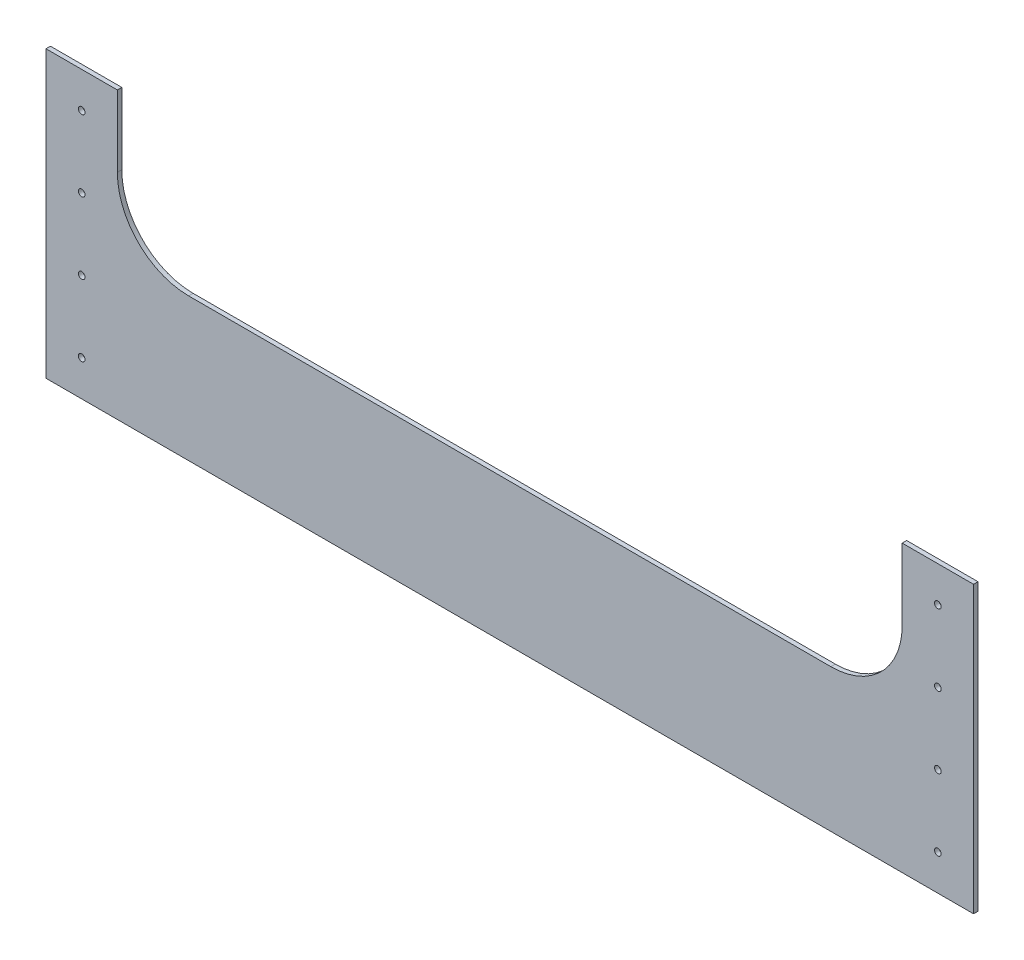
ISO-10303-21;
HEADER;
FILE_DESCRIPTION(('STEP AP214'),'2;1');
FILE_NAME('part.step','',(''),(''),'','','');
FILE_SCHEMA(('AUTOMOTIVE_DESIGN { 1 0 10303 214 1 1 1 1 }'));
ENDSEC;
DATA;
#1=APPLICATION_CONTEXT('core data for automotive mechanical design processes');
#2=APPLICATION_PROTOCOL_DEFINITION('international standard','automotive_design',2000,#1);
#3=PRODUCT_CONTEXT('',#1,'mechanical');
#4=PRODUCT('Part','Part','',(#3));
#5=PRODUCT_RELATED_PRODUCT_CATEGORY('part','',(#4));
#6=PRODUCT_DEFINITION_FORMATION('','',#4);
#7=PRODUCT_DEFINITION_CONTEXT('part definition',#1,'design');
#8=PRODUCT_DEFINITION('design','',#6,#7);
#9=PRODUCT_DEFINITION_SHAPE('','',#8);
#10=(LENGTH_UNIT() NAMED_UNIT(*) SI_UNIT(.MILLI.,.METRE.));
#11=(NAMED_UNIT(*) PLANE_ANGLE_UNIT() SI_UNIT($,.RADIAN.));
#12=(NAMED_UNIT(*) SI_UNIT($,.STERADIAN.) SOLID_ANGLE_UNIT());
#13=UNCERTAINTY_MEASURE_WITH_UNIT(LENGTH_MEASURE(1.E-05),#10,'distance_accuracy_value','');
#14=(GEOMETRIC_REPRESENTATION_CONTEXT(3) GLOBAL_UNCERTAINTY_ASSIGNED_CONTEXT((#13)) GLOBAL_UNIT_ASSIGNED_CONTEXT((#10,
#11,#12)) REPRESENTATION_CONTEXT('',''));
#15=CARTESIAN_POINT('',(0.,0.,0.));
#16=DIRECTION('',(0.,0.,1.));
#17=DIRECTION('',(1.,0.,0.));
#18=AXIS2_PLACEMENT_3D('',#15,#16,#17);
#19=CARTESIAN_POINT('',(-228.6,152.4,3.175));
#20=DIRECTION('',(0.,0.,1.));
#21=DIRECTION('',(1.,0.,0.));
#22=AXIS2_PLACEMENT_3D('',#19,#20,#21);
#23=PLANE('',#22);
#24=CARTESIAN_POINT('',(304.800000000003,76.2,3.175));
#25=DIRECTION('',(0.,0.,1.));
#26=DIRECTION('',(1.,0.,0.));
#27=AXIS2_PLACEMENT_3D('',#24,#25,#26);
#28=CIRCLE('',#27,2.38125);
#29=CARTESIAN_POINT('',(307.181250000003,76.2,3.175));
#30=VERTEX_POINT('',#29);
#31=EDGE_CURVE('E250',#30,#30,#28,.T.);
#32=ORIENTED_EDGE('',*,*,#31,.F.);
#33=EDGE_LOOP('',(#32));
#34=FACE_BOUND('',#33,.T.);
#35=CARTESIAN_POINT('',(304.8,177.8,3.175));
#36=DIRECTION('',(0.,0.,1.));
#37=DIRECTION('',(1.,0.,0.));
#38=AXIS2_PLACEMENT_3D('',#35,#36,#37);
#39=CIRCLE('',#38,2.38125);
#40=CARTESIAN_POINT('',(307.18125,177.8,3.175));
#41=VERTEX_POINT('',#40);
#42=EDGE_CURVE('E238',#41,#41,#39,.T.);
#43=ORIENTED_EDGE('',*,*,#42,.F.);
#44=EDGE_LOOP('',(#43));
#45=FACE_BOUND('',#44,.T.);
#46=CARTESIAN_POINT('',(-304.799999999999,76.2,3.175));
#47=DIRECTION('',(0.,0.,1.));
#48=DIRECTION('',(1.,0.,0.));
#49=AXIS2_PLACEMENT_3D('',#46,#47,#48);
#50=CIRCLE('',#49,2.38125);
#51=CARTESIAN_POINT('',(-302.418749999999,76.2,3.175));
#52=VERTEX_POINT('',#51);
#53=EDGE_CURVE('E226',#52,#52,#50,.T.);
#54=ORIENTED_EDGE('',*,*,#53,.F.);
#55=EDGE_LOOP('',(#54));
#56=FACE_BOUND('',#55,.T.);
#57=CARTESIAN_POINT('',(-304.8,177.8,3.175));
#58=DIRECTION('',(0.,0.,1.));
#59=DIRECTION('',(1.,0.,0.));
#60=AXIS2_PLACEMENT_3D('',#57,#58,#59);
#61=CIRCLE('',#60,2.38125);
#62=CARTESIAN_POINT('',(-302.41875,177.8,3.175));
#63=VERTEX_POINT('',#62);
#64=EDGE_CURVE('E154',#63,#63,#61,.T.);
#65=ORIENTED_EDGE('',*,*,#64,.F.);
#66=EDGE_LOOP('',(#65));
#67=FACE_BOUND('',#66,.T.);
#68=DIRECTION('',(-1.,0.,0.));
#69=VECTOR('',#68,1.);
#70=CARTESIAN_POINT('',(-330.2,203.2,3.175));
#71=LINE('',#70,#69);
#72=CARTESIAN_POINT('',(-279.4,203.2,3.175));
#73=VERTEX_POINT('',#72);
#74=CARTESIAN_POINT('',(-330.2,203.2,3.175));
#75=VERTEX_POINT('',#74);
#76=EDGE_CURVE('E169',#73,#75,#71,.T.);
#77=ORIENTED_EDGE('',*,*,#76,.T.);
#78=DIRECTION('',(0.,-1.,0.));
#79=VECTOR('',#78,1.);
#80=CARTESIAN_POINT('',(-330.2,0.,3.175));
#81=LINE('',#80,#79);
#82=CARTESIAN_POINT('',(-330.2,0.,3.175));
#83=VERTEX_POINT('',#82);
#84=EDGE_CURVE('E107',#75,#83,#81,.T.);
#85=ORIENTED_EDGE('',*,*,#84,.T.);
#86=DIRECTION('',(1.,0.,0.));
#87=VECTOR('',#86,1.);
#88=CARTESIAN_POINT('',(330.2,0.,3.175));
#89=LINE('',#88,#87);
#90=CARTESIAN_POINT('',(330.2,0.,3.175));
#91=VERTEX_POINT('',#90);
#92=EDGE_CURVE('E190',#83,#91,#89,.T.);
#93=ORIENTED_EDGE('',*,*,#92,.T.);
#94=DIRECTION('',(0.,1.,0.));
#95=VECTOR('',#94,1.);
#96=CARTESIAN_POINT('',(330.2,203.2,3.175));
#97=LINE('',#96,#95);
#98=CARTESIAN_POINT('',(330.2,203.2,3.175));
#99=VERTEX_POINT('',#98);
#100=EDGE_CURVE('E209',#91,#99,#97,.T.);
#101=ORIENTED_EDGE('',*,*,#100,.T.);
#102=DIRECTION('',(-1.,0.,0.));
#103=VECTOR('',#102,1.);
#104=CARTESIAN_POINT('',(279.4,203.2,3.175));
#105=LINE('',#104,#103);
#106=CARTESIAN_POINT('',(279.4,203.2,3.175));
#107=VERTEX_POINT('',#106);
#108=EDGE_CURVE('E206',#99,#107,#105,.T.);
#109=ORIENTED_EDGE('',*,*,#108,.T.);
#110=DIRECTION('',(0.,-1.,0.));
#111=VECTOR('',#110,1.);
#112=CARTESIAN_POINT('',(279.4,152.4,3.175));
#113=LINE('',#112,#111);
#114=CARTESIAN_POINT('',(279.4,152.4,3.175));
#115=VERTEX_POINT('',#114);
#116=EDGE_CURVE('E208',#107,#115,#113,.T.);
#117=ORIENTED_EDGE('',*,*,#116,.T.);
#118=CARTESIAN_POINT('',(228.6,152.4,3.175));
#119=DIRECTION('',(0.,0.,-1.));
#120=DIRECTION('',(1.,0.,0.));
#121=AXIS2_PLACEMENT_3D('',#118,#119,#120);
#122=CIRCLE('',#121,50.8);
#123=CARTESIAN_POINT('',(228.6,101.6,3.175));
#124=VERTEX_POINT('',#123);
#125=EDGE_CURVE('E132',#115,#124,#122,.T.);
#126=ORIENTED_EDGE('',*,*,#125,.T.);
#127=DIRECTION('',(-1.,0.,0.));
#128=VECTOR('',#127,1.);
#129=CARTESIAN_POINT('',(-228.6,101.6,3.175));
#130=LINE('',#129,#128);
#131=CARTESIAN_POINT('',(-228.6,101.6,3.175));
#132=VERTEX_POINT('',#131);
#133=EDGE_CURVE('E126',#124,#132,#130,.T.);
#134=ORIENTED_EDGE('',*,*,#133,.T.);
#135=CARTESIAN_POINT('',(-228.6,152.4,3.175));
#136=DIRECTION('',(0.,0.,-1.));
#137=DIRECTION('',(1.,0.,0.));
#138=AXIS2_PLACEMENT_3D('',#135,#136,#137);
#139=CIRCLE('',#138,50.8);
#140=CARTESIAN_POINT('',(-279.4,152.4,3.175));
#141=VERTEX_POINT('',#140);
#142=EDGE_CURVE('E130',#132,#141,#139,.T.);
#143=ORIENTED_EDGE('',*,*,#142,.T.);
#144=DIRECTION('',(0.,1.,0.));
#145=VECTOR('',#144,1.);
#146=CARTESIAN_POINT('',(-279.4,203.2,3.175));
#147=LINE('',#146,#145);
#148=EDGE_CURVE('E58',#141,#73,#147,.T.);
#149=ORIENTED_EDGE('',*,*,#148,.T.);
#150=EDGE_LOOP('',(#77,#85,#93,#101,#109,#117,#126,#134,#143,#149));
#151=FACE_BOUND('',#150,.T.);
#152=CARTESIAN_POINT('',(-304.799999999999,127.,3.175));
#153=DIRECTION('',(0.,0.,1.));
#154=DIRECTION('',(1.,0.,0.));
#155=AXIS2_PLACEMENT_3D('',#152,#153,#154);
#156=CIRCLE('',#155,2.38125000000001);
#157=CARTESIAN_POINT('',(-302.418749999999,127.,3.175));
#158=VERTEX_POINT('',#157);
#159=EDGE_CURVE('E220',#158,#158,#156,.T.);
#160=ORIENTED_EDGE('',*,*,#159,.F.);
#161=EDGE_LOOP('',(#160));
#162=FACE_BOUND('',#161,.T.);
#163=CARTESIAN_POINT('',(-304.799999999998,25.4,3.175));
#164=DIRECTION('',(0.,0.,1.));
#165=DIRECTION('',(1.,0.,0.));
#166=AXIS2_PLACEMENT_3D('',#163,#164,#165);
#167=CIRCLE('',#166,2.38125);
#168=CARTESIAN_POINT('',(-302.418749999998,25.4,3.175));
#169=VERTEX_POINT('',#168);
#170=EDGE_CURVE('E232',#169,#169,#167,.T.);
#171=ORIENTED_EDGE('',*,*,#170,.F.);
#172=EDGE_LOOP('',(#171));
#173=FACE_BOUND('',#172,.T.);
#174=CARTESIAN_POINT('',(304.800000000001,127.,3.175));
#175=DIRECTION('',(0.,0.,1.));
#176=DIRECTION('',(1.,0.,0.));
#177=AXIS2_PLACEMENT_3D('',#174,#175,#176);
#178=CIRCLE('',#177,2.38125);
#179=CARTESIAN_POINT('',(307.181250000001,127.,3.175));
#180=VERTEX_POINT('',#179);
#181=EDGE_CURVE('E244',#180,#180,#178,.T.);
#182=ORIENTED_EDGE('',*,*,#181,.F.);
#183=EDGE_LOOP('',(#182));
#184=FACE_BOUND('',#183,.T.);
#185=CARTESIAN_POINT('',(304.800000000004,25.3999999999999,3.175));
#186=DIRECTION('',(0.,0.,1.));
#187=DIRECTION('',(1.,0.,0.));
#188=AXIS2_PLACEMENT_3D('',#185,#186,#187);
#189=CIRCLE('',#188,2.38125000000001);
#190=CARTESIAN_POINT('',(307.181250000004,25.3999999999999,3.175));
#191=VERTEX_POINT('',#190);
#192=EDGE_CURVE('E256',#191,#191,#189,.T.);
#193=ORIENTED_EDGE('',*,*,#192,.F.);
#194=EDGE_LOOP('',(#193));
#195=FACE_BOUND('',#194,.T.);
#196=ADVANCED_FACE('F41',(#34,#45,#56,#67,#151,#162,#173,#184,#195),#23,.T.);
#197=CARTESIAN_POINT('',(-228.6,152.4,0.));
#198=DIRECTION('',(0.,0.,1.));
#199=DIRECTION('',(1.,0.,0.));
#200=AXIS2_PLACEMENT_3D('',#197,#198,#199);
#201=PLANE('',#200);
#202=DIRECTION('',(-1.,0.,0.));
#203=VECTOR('',#202,1.);
#204=CARTESIAN_POINT('',(-330.2,203.2,0.));
#205=LINE('',#204,#203);
#206=CARTESIAN_POINT('',(-279.4,203.2,0.));
#207=VERTEX_POINT('',#206);
#208=CARTESIAN_POINT('',(-330.2,203.2,0.));
#209=VERTEX_POINT('',#208);
#210=EDGE_CURVE('E150',#207,#209,#205,.T.);
#211=ORIENTED_EDGE('',*,*,#210,.F.);
#212=DIRECTION('',(0.,1.,0.));
#213=VECTOR('',#212,1.);
#214=CARTESIAN_POINT('',(-279.4,203.2,0.));
#215=LINE('',#214,#213);
#216=CARTESIAN_POINT('',(-279.4,152.4,0.));
#217=VERTEX_POINT('',#216);
#218=EDGE_CURVE('E99',#217,#207,#215,.T.);
#219=ORIENTED_EDGE('',*,*,#218,.F.);
#220=CARTESIAN_POINT('',(-228.6,152.4,0.));
#221=DIRECTION('',(0.,0.,-1.));
#222=DIRECTION('',(1.,0.,0.));
#223=AXIS2_PLACEMENT_3D('',#220,#221,#222);
#224=CIRCLE('',#223,50.8);
#225=CARTESIAN_POINT('',(-228.6,101.6,0.));
#226=VERTEX_POINT('',#225);
#227=EDGE_CURVE('E93',#226,#217,#224,.T.);
#228=ORIENTED_EDGE('',*,*,#227,.F.);
#229=DIRECTION('',(-1.,0.,0.));
#230=VECTOR('',#229,1.);
#231=CARTESIAN_POINT('',(-228.6,101.6,0.));
#232=LINE('',#231,#230);
#233=CARTESIAN_POINT('',(228.6,101.6,0.));
#234=VERTEX_POINT('',#233);
#235=EDGE_CURVE('E140',#234,#226,#232,.T.);
#236=ORIENTED_EDGE('',*,*,#235,.F.);
#237=CARTESIAN_POINT('',(228.6,152.4,0.));
#238=DIRECTION('',(0.,0.,-1.));
#239=DIRECTION('',(1.,0.,0.));
#240=AXIS2_PLACEMENT_3D('',#237,#238,#239);
#241=CIRCLE('',#240,50.8);
#242=CARTESIAN_POINT('',(279.4,152.4,0.));
#243=VERTEX_POINT('',#242);
#244=EDGE_CURVE('E164',#243,#234,#241,.T.);
#245=ORIENTED_EDGE('',*,*,#244,.F.);
#246=DIRECTION('',(0.,-1.,0.));
#247=VECTOR('',#246,1.);
#248=CARTESIAN_POINT('',(279.4,152.4,0.));
#249=LINE('',#248,#247);
#250=CARTESIAN_POINT('',(279.4,203.2,0.));
#251=VERTEX_POINT('',#250);
#252=EDGE_CURVE('E162',#251,#243,#249,.T.);
#253=ORIENTED_EDGE('',*,*,#252,.F.);
#254=DIRECTION('',(-1.,0.,0.));
#255=VECTOR('',#254,1.);
#256=CARTESIAN_POINT('',(279.4,203.2,0.));
#257=LINE('',#256,#255);
#258=CARTESIAN_POINT('',(330.2,203.2,0.));
#259=VERTEX_POINT('',#258);
#260=EDGE_CURVE('E160',#259,#251,#257,.T.);
#261=ORIENTED_EDGE('',*,*,#260,.F.);
#262=DIRECTION('',(0.,1.,0.));
#263=VECTOR('',#262,1.);
#264=CARTESIAN_POINT('',(330.2,203.2,0.));
#265=LINE('',#264,#263);
#266=CARTESIAN_POINT('',(330.2,0.,0.));
#267=VERTEX_POINT('',#266);
#268=EDGE_CURVE('E158',#267,#259,#265,.T.);
#269=ORIENTED_EDGE('',*,*,#268,.F.);
#270=DIRECTION('',(1.,0.,0.));
#271=VECTOR('',#270,1.);
#272=CARTESIAN_POINT('',(330.2,0.,0.));
#273=LINE('',#272,#271);
#274=CARTESIAN_POINT('',(-330.2,0.,0.));
#275=VERTEX_POINT('',#274);
#276=EDGE_CURVE('E156',#275,#267,#273,.T.);
#277=ORIENTED_EDGE('',*,*,#276,.F.);
#278=DIRECTION('',(0.,-1.,0.));
#279=VECTOR('',#278,1.);
#280=CARTESIAN_POINT('',(-330.2,0.,0.));
#281=LINE('',#280,#279);
#282=EDGE_CURVE('E153',#209,#275,#281,.T.);
#283=ORIENTED_EDGE('',*,*,#282,.F.);
#284=EDGE_LOOP('',(#211,#219,#228,#236,#245,#253,#261,#269,#277,#283));
#285=FACE_BOUND('',#284,.T.);
#286=CARTESIAN_POINT('',(-304.8,177.8,0.));
#287=DIRECTION('',(0.,0.,1.));
#288=DIRECTION('',(1.,0.,0.));
#289=AXIS2_PLACEMENT_3D('',#286,#287,#288);
#290=CIRCLE('',#289,2.38125);
#291=CARTESIAN_POINT('',(-302.41875,177.8,0.));
#292=VERTEX_POINT('',#291);
#293=EDGE_CURVE('E217',#292,#292,#290,.T.);
#294=ORIENTED_EDGE('',*,*,#293,.T.);
#295=EDGE_LOOP('',(#294));
#296=FACE_BOUND('',#295,.T.);
#297=CARTESIAN_POINT('',(-304.799999999999,127.,0.));
#298=DIRECTION('',(0.,0.,1.));
#299=DIRECTION('',(1.,0.,0.));
#300=AXIS2_PLACEMENT_3D('',#297,#298,#299);
#301=CIRCLE('',#300,2.38125000000001);
#302=CARTESIAN_POINT('',(-302.418749999999,127.,0.));
#303=VERTEX_POINT('',#302);
#304=EDGE_CURVE('E223',#303,#303,#301,.T.);
#305=ORIENTED_EDGE('',*,*,#304,.T.);
#306=EDGE_LOOP('',(#305));
#307=FACE_BOUND('',#306,.T.);
#308=CARTESIAN_POINT('',(-304.799999999999,76.2,0.));
#309=DIRECTION('',(0.,0.,1.));
#310=DIRECTION('',(1.,0.,0.));
#311=AXIS2_PLACEMENT_3D('',#308,#309,#310);
#312=CIRCLE('',#311,2.38125);
#313=CARTESIAN_POINT('',(-302.418749999999,76.2,0.));
#314=VERTEX_POINT('',#313);
#315=EDGE_CURVE('E229',#314,#314,#312,.T.);
#316=ORIENTED_EDGE('',*,*,#315,.T.);
#317=EDGE_LOOP('',(#316));
#318=FACE_BOUND('',#317,.T.);
#319=CARTESIAN_POINT('',(-304.799999999998,25.4,0.));
#320=DIRECTION('',(0.,0.,1.));
#321=DIRECTION('',(1.,0.,0.));
#322=AXIS2_PLACEMENT_3D('',#319,#320,#321);
#323=CIRCLE('',#322,2.38125);
#324=CARTESIAN_POINT('',(-302.418749999998,25.4,0.));
#325=VERTEX_POINT('',#324);
#326=EDGE_CURVE('E235',#325,#325,#323,.T.);
#327=ORIENTED_EDGE('',*,*,#326,.T.);
#328=EDGE_LOOP('',(#327));
#329=FACE_BOUND('',#328,.T.);
#330=CARTESIAN_POINT('',(304.8,177.8,0.));
#331=DIRECTION('',(0.,0.,1.));
#332=DIRECTION('',(1.,0.,0.));
#333=AXIS2_PLACEMENT_3D('',#330,#331,#332);
#334=CIRCLE('',#333,2.38125);
#335=CARTESIAN_POINT('',(307.18125,177.8,0.));
#336=VERTEX_POINT('',#335);
#337=EDGE_CURVE('E241',#336,#336,#334,.T.);
#338=ORIENTED_EDGE('',*,*,#337,.T.);
#339=EDGE_LOOP('',(#338));
#340=FACE_BOUND('',#339,.T.);
#341=CARTESIAN_POINT('',(304.800000000001,127.,0.));
#342=DIRECTION('',(0.,0.,1.));
#343=DIRECTION('',(1.,0.,0.));
#344=AXIS2_PLACEMENT_3D('',#341,#342,#343);
#345=CIRCLE('',#344,2.38125);
#346=CARTESIAN_POINT('',(307.181250000001,127.,0.));
#347=VERTEX_POINT('',#346);
#348=EDGE_CURVE('E247',#347,#347,#345,.T.);
#349=ORIENTED_EDGE('',*,*,#348,.T.);
#350=EDGE_LOOP('',(#349));
#351=FACE_BOUND('',#350,.T.);
#352=CARTESIAN_POINT('',(304.800000000003,76.2,0.));
#353=DIRECTION('',(0.,0.,1.));
#354=DIRECTION('',(1.,0.,0.));
#355=AXIS2_PLACEMENT_3D('',#352,#353,#354);
#356=CIRCLE('',#355,2.38125);
#357=CARTESIAN_POINT('',(307.181250000003,76.2,0.));
#358=VERTEX_POINT('',#357);
#359=EDGE_CURVE('E253',#358,#358,#356,.T.);
#360=ORIENTED_EDGE('',*,*,#359,.T.);
#361=EDGE_LOOP('',(#360));
#362=FACE_BOUND('',#361,.T.);
#363=CARTESIAN_POINT('',(304.800000000004,25.3999999999999,0.));
#364=DIRECTION('',(0.,0.,1.));
#365=DIRECTION('',(1.,0.,0.));
#366=AXIS2_PLACEMENT_3D('',#363,#364,#365);
#367=CIRCLE('',#366,2.38125000000001);
#368=CARTESIAN_POINT('',(307.181250000004,25.3999999999999,0.));
#369=VERTEX_POINT('',#368);
#370=EDGE_CURVE('E259',#369,#369,#367,.T.);
#371=ORIENTED_EDGE('',*,*,#370,.T.);
#372=EDGE_LOOP('',(#371));
#373=FACE_BOUND('',#372,.T.);
#374=ADVANCED_FACE('F194',(#285,#296,#307,#318,#329,#340,#351,#362,#373),#201,.F.);
#375=CARTESIAN_POINT('',(-330.2,203.2,3.175));
#376=DIRECTION('',(0.,-1.,0.));
#377=DIRECTION('',(0.,0.,-1.));
#378=AXIS2_PLACEMENT_3D('',#375,#376,#377);
#379=PLANE('',#378);
#380=ORIENTED_EDGE('',*,*,#210,.T.);
#381=DIRECTION('',(0.,0.,-1.));
#382=VECTOR('',#381,1.);
#383=CARTESIAN_POINT('',(-330.2,203.2,3.175));
#384=LINE('',#383,#382);
#385=EDGE_CURVE('E11',#75,#209,#384,.T.);
#386=ORIENTED_EDGE('',*,*,#385,.F.);
#387=ORIENTED_EDGE('',*,*,#76,.F.);
#388=DIRECTION('',(0.,0.,-1.));
#389=VECTOR('',#388,1.);
#390=CARTESIAN_POINT('',(-279.4,203.2,3.175));
#391=LINE('',#390,#389);
#392=EDGE_CURVE('E146',#73,#207,#391,.T.);
#393=ORIENTED_EDGE('',*,*,#392,.T.);
#394=EDGE_LOOP('',(#380,#386,#387,#393));
#395=FACE_BOUND('',#394,.T.);
#396=ADVANCED_FACE('F43',(#395),#379,.F.);
#397=CARTESIAN_POINT('',(-330.2,0.,3.175));
#398=DIRECTION('',(1.,0.,0.));
#399=DIRECTION('',(0.,0.,-1.));
#400=AXIS2_PLACEMENT_3D('',#397,#398,#399);
#401=PLANE('',#400);
#402=ORIENTED_EDGE('',*,*,#282,.T.);
#403=DIRECTION('',(0.,0.,-1.));
#404=VECTOR('',#403,1.);
#405=CARTESIAN_POINT('',(-330.2,0.,3.175));
#406=LINE('',#405,#404);
#407=EDGE_CURVE('E50',#83,#275,#406,.T.);
#408=ORIENTED_EDGE('',*,*,#407,.F.);
#409=ORIENTED_EDGE('',*,*,#84,.F.);
#410=ORIENTED_EDGE('',*,*,#385,.T.);
#411=EDGE_LOOP('',(#402,#408,#409,#410));
#412=FACE_BOUND('',#411,.T.);
#413=ADVANCED_FACE('F301',(#412),#401,.F.);
#414=CARTESIAN_POINT('',(330.2,0.,3.175));
#415=DIRECTION('',(0.,1.,0.));
#416=DIRECTION('',(0.,0.,1.));
#417=AXIS2_PLACEMENT_3D('',#414,#415,#416);
#418=PLANE('',#417);
#419=ORIENTED_EDGE('',*,*,#276,.T.);
#420=DIRECTION('',(0.,0.,-1.));
#421=VECTOR('',#420,1.);
#422=CARTESIAN_POINT('',(330.2,0.,3.175));
#423=LINE('',#422,#421);
#424=EDGE_CURVE('E182',#91,#267,#423,.T.);
#425=ORIENTED_EDGE('',*,*,#424,.F.);
#426=ORIENTED_EDGE('',*,*,#92,.F.);
#427=ORIENTED_EDGE('',*,*,#407,.T.);
#428=EDGE_LOOP('',(#419,#425,#426,#427));
#429=FACE_BOUND('',#428,.T.);
#430=ADVANCED_FACE('F188',(#429),#418,.F.);
#431=CARTESIAN_POINT('',(330.2,203.2,3.175));
#432=DIRECTION('',(-1.,0.,0.));
#433=DIRECTION('',(0.,0.,1.));
#434=AXIS2_PLACEMENT_3D('',#431,#432,#433);
#435=PLANE('',#434);
#436=ORIENTED_EDGE('',*,*,#268,.T.);
#437=DIRECTION('',(0.,0.,-1.));
#438=VECTOR('',#437,1.);
#439=CARTESIAN_POINT('',(330.2,203.2,3.175));
#440=LINE('',#439,#438);
#441=EDGE_CURVE('E179',#99,#259,#440,.T.);
#442=ORIENTED_EDGE('',*,*,#441,.F.);
#443=ORIENTED_EDGE('',*,*,#100,.F.);
#444=ORIENTED_EDGE('',*,*,#424,.T.);
#445=EDGE_LOOP('',(#436,#442,#443,#444));
#446=FACE_BOUND('',#445,.T.);
#447=ADVANCED_FACE('F200',(#446),#435,.F.);
#448=CARTESIAN_POINT('',(279.4,203.2,3.175));
#449=DIRECTION('',(0.,-1.,0.));
#450=DIRECTION('',(0.,0.,-1.));
#451=AXIS2_PLACEMENT_3D('',#448,#449,#450);
#452=PLANE('',#451);
#453=ORIENTED_EDGE('',*,*,#260,.T.);
#454=DIRECTION('',(0.,0.,-1.));
#455=VECTOR('',#454,1.);
#456=CARTESIAN_POINT('',(279.4,203.2,3.175));
#457=LINE('',#456,#455);
#458=EDGE_CURVE('E176',#107,#251,#457,.T.);
#459=ORIENTED_EDGE('',*,*,#458,.F.);
#460=ORIENTED_EDGE('',*,*,#108,.F.);
#461=ORIENTED_EDGE('',*,*,#441,.T.);
#462=EDGE_LOOP('',(#453,#459,#460,#461));
#463=FACE_BOUND('',#462,.T.);
#464=ADVANCED_FACE('F204',(#463),#452,.F.);
#465=CARTESIAN_POINT('',(279.4,152.4,3.175));
#466=DIRECTION('',(1.,0.,0.));
#467=DIRECTION('',(0.,0.,-1.));
#468=AXIS2_PLACEMENT_3D('',#465,#466,#467);
#469=PLANE('',#468);
#470=ORIENTED_EDGE('',*,*,#252,.T.);
#471=DIRECTION('',(0.,0.,-1.));
#472=VECTOR('',#471,1.);
#473=CARTESIAN_POINT('',(279.4,152.4,3.175));
#474=LINE('',#473,#472);
#475=EDGE_CURVE('E173',#115,#243,#474,.T.);
#476=ORIENTED_EDGE('',*,*,#475,.F.);
#477=ORIENTED_EDGE('',*,*,#116,.F.);
#478=ORIENTED_EDGE('',*,*,#458,.T.);
#479=EDGE_LOOP('',(#470,#476,#477,#478));
#480=FACE_BOUND('',#479,.T.);
#481=ADVANCED_FACE('F291',(#480),#469,.F.);
#482=CARTESIAN_POINT('',(228.6,152.4,3.175));
#483=DIRECTION('',(0.,0.,-1.));
#484=DIRECTION('',(-1.,0.,0.));
#485=AXIS2_PLACEMENT_3D('',#482,#483,#484);
#486=CYLINDRICAL_SURFACE('',#485,50.8);
#487=ORIENTED_EDGE('',*,*,#244,.T.);
#488=DIRECTION('',(0.,0.,-1.));
#489=VECTOR('',#488,1.);
#490=CARTESIAN_POINT('',(228.6,101.6,3.175));
#491=LINE('',#490,#489);
#492=EDGE_CURVE('E141',#124,#234,#491,.T.);
#493=ORIENTED_EDGE('',*,*,#492,.F.);
#494=ORIENTED_EDGE('',*,*,#125,.F.);
#495=ORIENTED_EDGE('',*,*,#475,.T.);
#496=EDGE_LOOP('',(#487,#493,#494,#495));
#497=FACE_BOUND('',#496,.T.);
#498=ADVANCED_FACE('F288',(#497),#486,.F.);
#499=CARTESIAN_POINT('',(-228.6,101.6,3.175));
#500=DIRECTION('',(0.,-1.,0.));
#501=DIRECTION('',(0.,0.,-1.));
#502=AXIS2_PLACEMENT_3D('',#499,#500,#501);
#503=PLANE('',#502);
#504=ORIENTED_EDGE('',*,*,#235,.T.);
#505=DIRECTION('',(0.,0.,-1.));
#506=VECTOR('',#505,1.);
#507=CARTESIAN_POINT('',(-228.6,101.6,3.175));
#508=LINE('',#507,#506);
#509=EDGE_CURVE('E137',#132,#226,#508,.T.);
#510=ORIENTED_EDGE('',*,*,#509,.F.);
#511=ORIENTED_EDGE('',*,*,#133,.F.);
#512=ORIENTED_EDGE('',*,*,#492,.T.);
#513=EDGE_LOOP('',(#504,#510,#511,#512));
#514=FACE_BOUND('',#513,.T.);
#515=ADVANCED_FACE('F138',(#514),#503,.F.);
#516=CARTESIAN_POINT('',(-228.6,152.4,3.175));
#517=DIRECTION('',(0.,0.,-1.));
#518=DIRECTION('',(-1.,0.,0.));
#519=AXIS2_PLACEMENT_3D('',#516,#517,#518);
#520=CYLINDRICAL_SURFACE('',#519,50.8);
#521=ORIENTED_EDGE('',*,*,#227,.T.);
#522=DIRECTION('',(0.,0.,-1.));
#523=VECTOR('',#522,1.);
#524=CARTESIAN_POINT('',(-279.4,152.4,3.175));
#525=LINE('',#524,#523);
#526=EDGE_CURVE('E142',#141,#217,#525,.T.);
#527=ORIENTED_EDGE('',*,*,#526,.F.);
#528=ORIENTED_EDGE('',*,*,#142,.F.);
#529=ORIENTED_EDGE('',*,*,#509,.T.);
#530=EDGE_LOOP('',(#521,#527,#528,#529));
#531=FACE_BOUND('',#530,.T.);
#532=ADVANCED_FACE('F144',(#531),#520,.F.);
#533=CARTESIAN_POINT('',(-279.4,203.2,3.175));
#534=DIRECTION('',(-1.,0.,0.));
#535=DIRECTION('',(0.,0.,1.));
#536=AXIS2_PLACEMENT_3D('',#533,#534,#535);
#537=PLANE('',#536);
#538=ORIENTED_EDGE('',*,*,#218,.T.);
#539=ORIENTED_EDGE('',*,*,#392,.F.);
#540=ORIENTED_EDGE('',*,*,#148,.F.);
#541=ORIENTED_EDGE('',*,*,#526,.T.);
#542=EDGE_LOOP('',(#538,#539,#540,#541));
#543=FACE_BOUND('',#542,.T.);
#544=ADVANCED_FACE('F281',(#543),#537,.F.);
#545=CARTESIAN_POINT('',(-304.8,177.8,3.175));
#546=DIRECTION('',(0.,0.,-1.));
#547=DIRECTION('',(-1.,0.,0.));
#548=AXIS2_PLACEMENT_3D('',#545,#546,#547);
#549=CYLINDRICAL_SURFACE('',#548,2.38125);
#550=ORIENTED_EDGE('',*,*,#64,.T.);
#551=EDGE_LOOP('',(#550));
#552=FACE_BOUND('',#551,.T.);
#553=ORIENTED_EDGE('',*,*,#293,.F.);
#554=EDGE_LOOP('',(#553));
#555=FACE_BOUND('',#554,.T.);
#556=ADVANCED_FACE('F278',(#552,#555),#549,.F.);
#557=CARTESIAN_POINT('',(-304.799999999999,127.,3.175));
#558=DIRECTION('',(0.,0.,-1.));
#559=DIRECTION('',(-1.,0.,0.));
#560=AXIS2_PLACEMENT_3D('',#557,#558,#559);
#561=CYLINDRICAL_SURFACE('',#560,2.38125000000001);
#562=ORIENTED_EDGE('',*,*,#159,.T.);
#563=EDGE_LOOP('',(#562));
#564=FACE_BOUND('',#563,.T.);
#565=ORIENTED_EDGE('',*,*,#304,.F.);
#566=EDGE_LOOP('',(#565));
#567=FACE_BOUND('',#566,.T.);
#568=ADVANCED_FACE('F391',(#564,#567),#561,.F.);
#569=CARTESIAN_POINT('',(-304.799999999999,76.2,3.175));
#570=DIRECTION('',(0.,0.,-1.));
#571=DIRECTION('',(-1.,0.,0.));
#572=AXIS2_PLACEMENT_3D('',#569,#570,#571);
#573=CYLINDRICAL_SURFACE('',#572,2.38125);
#574=ORIENTED_EDGE('',*,*,#53,.T.);
#575=EDGE_LOOP('',(#574));
#576=FACE_BOUND('',#575,.T.);
#577=ORIENTED_EDGE('',*,*,#315,.F.);
#578=EDGE_LOOP('',(#577));
#579=FACE_BOUND('',#578,.T.);
#580=ADVANCED_FACE('F400',(#576,#579),#573,.F.);
#581=CARTESIAN_POINT('',(-304.799999999998,25.4,3.175));
#582=DIRECTION('',(0.,0.,-1.));
#583=DIRECTION('',(-1.,0.,0.));
#584=AXIS2_PLACEMENT_3D('',#581,#582,#583);
#585=CYLINDRICAL_SURFACE('',#584,2.38125);
#586=ORIENTED_EDGE('',*,*,#170,.T.);
#587=EDGE_LOOP('',(#586));
#588=FACE_BOUND('',#587,.T.);
#589=ORIENTED_EDGE('',*,*,#326,.F.);
#590=EDGE_LOOP('',(#589));
#591=FACE_BOUND('',#590,.T.);
#592=ADVANCED_FACE('F409',(#588,#591),#585,.F.);
#593=CARTESIAN_POINT('',(304.8,177.8,3.175));
#594=DIRECTION('',(0.,0.,-1.));
#595=DIRECTION('',(-1.,0.,0.));
#596=AXIS2_PLACEMENT_3D('',#593,#594,#595);
#597=CYLINDRICAL_SURFACE('',#596,2.38125);
#598=ORIENTED_EDGE('',*,*,#42,.T.);
#599=EDGE_LOOP('',(#598));
#600=FACE_BOUND('',#599,.T.);
#601=ORIENTED_EDGE('',*,*,#337,.F.);
#602=EDGE_LOOP('',(#601));
#603=FACE_BOUND('',#602,.T.);
#604=ADVANCED_FACE('F419',(#600,#603),#597,.F.);
#605=CARTESIAN_POINT('',(304.800000000001,127.,3.175));
#606=DIRECTION('',(0.,0.,-1.));
#607=DIRECTION('',(-1.,0.,0.));
#608=AXIS2_PLACEMENT_3D('',#605,#606,#607);
#609=CYLINDRICAL_SURFACE('',#608,2.38125);
#610=ORIENTED_EDGE('',*,*,#181,.T.);
#611=EDGE_LOOP('',(#610));
#612=FACE_BOUND('',#611,.T.);
#613=ORIENTED_EDGE('',*,*,#348,.F.);
#614=EDGE_LOOP('',(#613));
#615=FACE_BOUND('',#614,.T.);
#616=ADVANCED_FACE('F429',(#612,#615),#609,.F.);
#617=CARTESIAN_POINT('',(304.800000000003,76.2,3.175));
#618=DIRECTION('',(0.,0.,-1.));
#619=DIRECTION('',(-1.,0.,0.));
#620=AXIS2_PLACEMENT_3D('',#617,#618,#619);
#621=CYLINDRICAL_SURFACE('',#620,2.38125);
#622=ORIENTED_EDGE('',*,*,#31,.T.);
#623=EDGE_LOOP('',(#622));
#624=FACE_BOUND('',#623,.T.);
#625=ORIENTED_EDGE('',*,*,#359,.F.);
#626=EDGE_LOOP('',(#625));
#627=FACE_BOUND('',#626,.T.);
#628=ADVANCED_FACE('F439',(#624,#627),#621,.F.);
#629=CARTESIAN_POINT('',(304.800000000004,25.3999999999999,3.175));
#630=DIRECTION('',(0.,0.,-1.));
#631=DIRECTION('',(-1.,0.,0.));
#632=AXIS2_PLACEMENT_3D('',#629,#630,#631);
#633=CYLINDRICAL_SURFACE('',#632,2.38125000000001);
#634=ORIENTED_EDGE('',*,*,#192,.T.);
#635=EDGE_LOOP('',(#634));
#636=FACE_BOUND('',#635,.T.);
#637=ORIENTED_EDGE('',*,*,#370,.F.);
#638=EDGE_LOOP('',(#637));
#639=FACE_BOUND('',#638,.T.);
#640=ADVANCED_FACE('F265',(#636,#639),#633,.F.);
#641=CLOSED_SHELL('',(#196,#374,#396,#413,#430,#447,#464,#481,#498,#515,#532,#544,#556,#568,
#580,#592,#604,#616,#628,#640));
#642=MANIFOLD_SOLID_BREP('B2',#641);
#643=ADVANCED_BREP_SHAPE_REPRESENTATION('',(#18,#642),#14);
#644=SHAPE_DEFINITION_REPRESENTATION(#9,#643);
ENDSEC;
END-ISO-10303-21;
